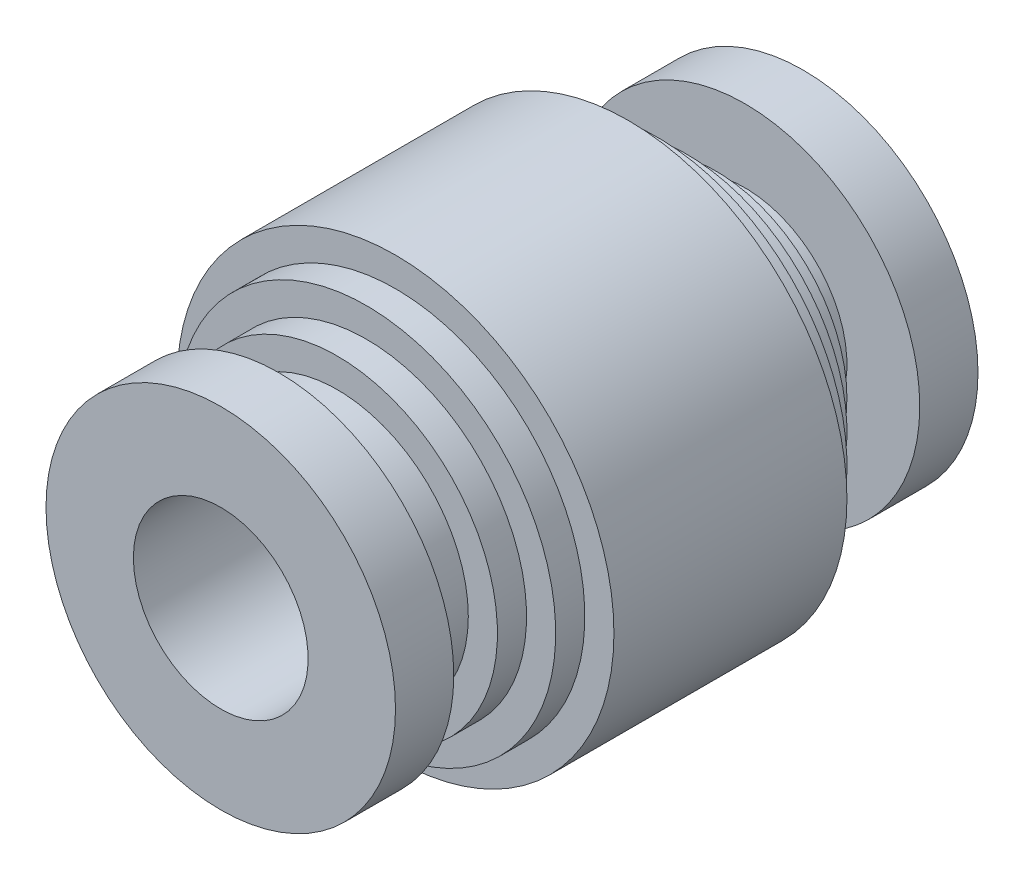
ISO-10303-21;
HEADER;
FILE_DESCRIPTION(('STEP AP214'),'2;1');
FILE_NAME('part.step','',(''),(''),'','','');
FILE_SCHEMA(('AUTOMOTIVE_DESIGN { 1 0 10303 214 1 1 1 1 }'));
ENDSEC;
DATA;
#1=APPLICATION_CONTEXT('core data for automotive mechanical design processes');
#2=APPLICATION_PROTOCOL_DEFINITION('international standard','automotive_design',2000,#1);
#3=PRODUCT_CONTEXT('',#1,'mechanical');
#4=PRODUCT('Part','Part','',(#3));
#5=PRODUCT_RELATED_PRODUCT_CATEGORY('part','',(#4));
#6=PRODUCT_DEFINITION_FORMATION('','',#4);
#7=PRODUCT_DEFINITION_CONTEXT('part definition',#1,'design');
#8=PRODUCT_DEFINITION('design','',#6,#7);
#9=PRODUCT_DEFINITION_SHAPE('','',#8);
#10=(LENGTH_UNIT() NAMED_UNIT(*) SI_UNIT(.MILLI.,.METRE.));
#11=(NAMED_UNIT(*) PLANE_ANGLE_UNIT() SI_UNIT($,.RADIAN.));
#12=(NAMED_UNIT(*) SI_UNIT($,.STERADIAN.) SOLID_ANGLE_UNIT());
#13=UNCERTAINTY_MEASURE_WITH_UNIT(LENGTH_MEASURE(1.E-05),#10,'distance_accuracy_value','');
#14=(GEOMETRIC_REPRESENTATION_CONTEXT(3) GLOBAL_UNCERTAINTY_ASSIGNED_CONTEXT((#13)) GLOBAL_UNIT_ASSIGNED_CONTEXT((#10,
#11,#12)) REPRESENTATION_CONTEXT('',''));
#15=CARTESIAN_POINT('',(0.,0.,0.));
#16=DIRECTION('',(0.,0.,1.));
#17=DIRECTION('',(1.,0.,0.));
#18=AXIS2_PLACEMENT_3D('',#15,#16,#17);
#19=CARTESIAN_POINT('',(0.,0.,6.));
#20=DIRECTION('',(0.,0.,1.));
#21=DIRECTION('',(1.,0.,0.));
#22=AXIS2_PLACEMENT_3D('',#19,#20,#21);
#23=PLANE('',#22);
#24=CARTESIAN_POINT('',(0.,0.,6.));
#25=DIRECTION('',(0.,0.,-1.));
#26=DIRECTION('',(-1.,0.,0.));
#27=AXIS2_PLACEMENT_3D('',#24,#25,#26);
#28=CIRCLE('',#27,4.5);
#29=CARTESIAN_POINT('',(-4.5,0.,6.));
#30=VERTEX_POINT('',#29);
#31=EDGE_CURVE('E112',#30,#30,#28,.T.);
#32=ORIENTED_EDGE('',*,*,#31,.T.);
#33=EDGE_LOOP('',(#32));
#34=FACE_BOUND('',#33,.T.);
#35=CARTESIAN_POINT('',(0.,0.,6.));
#36=DIRECTION('',(0.,0.,-1.));
#37=DIRECTION('',(-1.,0.,0.));
#38=AXIS2_PLACEMENT_3D('',#35,#36,#37);
#39=CIRCLE('',#38,5.5);
#40=CARTESIAN_POINT('',(-5.5,0.,6.));
#41=VERTEX_POINT('',#40);
#42=EDGE_CURVE('E10',#41,#41,#39,.T.);
#43=ORIENTED_EDGE('',*,*,#42,.F.);
#44=EDGE_LOOP('',(#43));
#45=FACE_BOUND('',#44,.T.);
#46=ADVANCED_FACE('F36',(#34,#45),#23,.T.);
#47=CARTESIAN_POINT('',(0.,0.,-9.99999999999999));
#48=DIRECTION('',(0.,0.,-1.));
#49=DIRECTION('',(-1.,0.,0.));
#50=AXIS2_PLACEMENT_3D('',#47,#48,#49);
#51=CYLINDRICAL_SURFACE('',#50,5.5);
#52=CARTESIAN_POINT('',(0.,0.,5.));
#53=DIRECTION('',(0.,0.,-1.));
#54=DIRECTION('',(-1.,0.,0.));
#55=AXIS2_PLACEMENT_3D('',#52,#53,#54);
#56=CIRCLE('',#55,5.5);
#57=CARTESIAN_POINT('',(-5.5,0.,5.));
#58=VERTEX_POINT('',#57);
#59=EDGE_CURVE('E42',#58,#58,#56,.T.);
#60=ORIENTED_EDGE('',*,*,#59,.F.);
#61=EDGE_LOOP('',(#60));
#62=FACE_BOUND('',#61,.T.);
#63=ORIENTED_EDGE('',*,*,#42,.T.);
#64=EDGE_LOOP('',(#63));
#65=FACE_BOUND('',#64,.T.);
#66=ADVANCED_FACE('F130',(#62,#65),#51,.T.);
#67=CARTESIAN_POINT('',(0.,0.,5.));
#68=DIRECTION('',(0.,0.,-1.));
#69=DIRECTION('',(-1.,0.,0.));
#70=AXIS2_PLACEMENT_3D('',#67,#68,#69);
#71=PLANE('',#70);
#72=CARTESIAN_POINT('',(0.,0.,5.));
#73=DIRECTION('',(0.,0.,-1.));
#74=DIRECTION('',(-1.,0.,0.));
#75=AXIS2_PLACEMENT_3D('',#72,#73,#74);
#76=CIRCLE('',#75,6.5);
#77=CARTESIAN_POINT('',(-6.5,0.,5.));
#78=VERTEX_POINT('',#77);
#79=EDGE_CURVE('E46',#78,#78,#76,.T.);
#80=ORIENTED_EDGE('',*,*,#79,.F.);
#81=EDGE_LOOP('',(#80));
#82=FACE_BOUND('',#81,.T.);
#83=ORIENTED_EDGE('',*,*,#59,.T.);
#84=EDGE_LOOP('',(#83));
#85=FACE_BOUND('',#84,.T.);
#86=ADVANCED_FACE('F134',(#82,#85),#71,.F.);
#87=CARTESIAN_POINT('',(0.,0.,-9.99999999999999));
#88=DIRECTION('',(0.,0.,-1.));
#89=DIRECTION('',(-1.,0.,0.));
#90=AXIS2_PLACEMENT_3D('',#87,#88,#89);
#91=CYLINDRICAL_SURFACE('',#90,6.5);
#92=CARTESIAN_POINT('',(0.,0.,4.));
#93=DIRECTION('',(0.,0.,-1.));
#94=DIRECTION('',(-1.,0.,0.));
#95=AXIS2_PLACEMENT_3D('',#92,#93,#94);
#96=CIRCLE('',#95,6.5);
#97=CARTESIAN_POINT('',(-6.5,0.,4.));
#98=VERTEX_POINT('',#97);
#99=EDGE_CURVE('E50',#98,#98,#96,.T.);
#100=ORIENTED_EDGE('',*,*,#99,.F.);
#101=EDGE_LOOP('',(#100));
#102=FACE_BOUND('',#101,.T.);
#103=ORIENTED_EDGE('',*,*,#79,.T.);
#104=EDGE_LOOP('',(#103));
#105=FACE_BOUND('',#104,.T.);
#106=ADVANCED_FACE('F139',(#102,#105),#91,.T.);
#107=CARTESIAN_POINT('',(0.,0.,4.));
#108=DIRECTION('',(0.,0.,-1.));
#109=DIRECTION('',(-1.,0.,0.));
#110=AXIS2_PLACEMENT_3D('',#107,#108,#109);
#111=PLANE('',#110);
#112=CARTESIAN_POINT('',(0.,0.,4.));
#113=DIRECTION('',(0.,0.,-1.));
#114=DIRECTION('',(-1.,0.,0.));
#115=AXIS2_PLACEMENT_3D('',#112,#113,#114);
#116=CIRCLE('',#115,7.5);
#117=CARTESIAN_POINT('',(-7.5,0.,4.));
#118=VERTEX_POINT('',#117);
#119=EDGE_CURVE('E55',#118,#118,#116,.T.);
#120=ORIENTED_EDGE('',*,*,#119,.F.);
#121=EDGE_LOOP('',(#120));
#122=FACE_BOUND('',#121,.T.);
#123=ORIENTED_EDGE('',*,*,#99,.T.);
#124=EDGE_LOOP('',(#123));
#125=FACE_BOUND('',#124,.T.);
#126=ADVANCED_FACE('F145',(#122,#125),#111,.F.);
#127=CARTESIAN_POINT('',(0.,0.,-9.99999999999999));
#128=DIRECTION('',(0.,0.,-1.));
#129=DIRECTION('',(-1.,0.,0.));
#130=AXIS2_PLACEMENT_3D('',#127,#128,#129);
#131=CYLINDRICAL_SURFACE('',#130,7.5);
#132=ORIENTED_EDGE('',*,*,#119,.T.);
#133=EDGE_LOOP('',(#132));
#134=FACE_BOUND('',#133,.T.);
#135=CARTESIAN_POINT('',(0.,0.,-4.));
#136=DIRECTION('',(0.,0.,-1.));
#137=DIRECTION('',(-1.,0.,0.));
#138=AXIS2_PLACEMENT_3D('',#135,#136,#137);
#139=CIRCLE('',#138,7.5);
#140=CARTESIAN_POINT('',(-7.5,0.,-4.));
#141=VERTEX_POINT('',#140);
#142=EDGE_CURVE('E58',#141,#141,#139,.T.);
#143=ORIENTED_EDGE('',*,*,#142,.F.);
#144=EDGE_LOOP('',(#143));
#145=FACE_BOUND('',#144,.T.);
#146=ADVANCED_FACE('F149',(#134,#145),#131,.T.);
#147=CARTESIAN_POINT('',(0.,0.,-4.));
#148=DIRECTION('',(0.,0.,-1.));
#149=DIRECTION('',(-1.,0.,0.));
#150=AXIS2_PLACEMENT_3D('',#147,#148,#149);
#151=PLANE('',#150);
#152=ORIENTED_EDGE('',*,*,#142,.T.);
#153=EDGE_LOOP('',(#152));
#154=FACE_BOUND('',#153,.T.);
#155=CARTESIAN_POINT('',(0.,0.,-4.));
#156=DIRECTION('',(0.,0.,-1.));
#157=DIRECTION('',(-1.,0.,0.));
#158=AXIS2_PLACEMENT_3D('',#155,#156,#157);
#159=CIRCLE('',#158,6.5);
#160=CARTESIAN_POINT('',(-6.5,0.,-4.));
#161=VERTEX_POINT('',#160);
#162=EDGE_CURVE('E61',#161,#161,#159,.T.);
#163=ORIENTED_EDGE('',*,*,#162,.F.);
#164=EDGE_LOOP('',(#163));
#165=FACE_BOUND('',#164,.T.);
#166=ADVANCED_FACE('F153',(#154,#165),#151,.T.);
#167=CARTESIAN_POINT('',(0.,0.,-9.99999999999999));
#168=DIRECTION('',(0.,0.,-1.));
#169=DIRECTION('',(-1.,0.,0.));
#170=AXIS2_PLACEMENT_3D('',#167,#168,#169);
#171=CYLINDRICAL_SURFACE('',#170,6.5);
#172=ORIENTED_EDGE('',*,*,#162,.T.);
#173=EDGE_LOOP('',(#172));
#174=FACE_BOUND('',#173,.T.);
#175=CARTESIAN_POINT('',(0.,0.,-5.));
#176=DIRECTION('',(0.,0.,-1.));
#177=DIRECTION('',(-1.,0.,0.));
#178=AXIS2_PLACEMENT_3D('',#175,#176,#177);
#179=CIRCLE('',#178,6.5);
#180=CARTESIAN_POINT('',(-6.5,0.,-5.));
#181=VERTEX_POINT('',#180);
#182=EDGE_CURVE('E64',#181,#181,#179,.T.);
#183=ORIENTED_EDGE('',*,*,#182,.F.);
#184=EDGE_LOOP('',(#183));
#185=FACE_BOUND('',#184,.T.);
#186=ADVANCED_FACE('F157',(#174,#185),#171,.T.);
#187=CARTESIAN_POINT('',(0.,0.,-5.));
#188=DIRECTION('',(0.,0.,-1.));
#189=DIRECTION('',(-1.,0.,0.));
#190=AXIS2_PLACEMENT_3D('',#187,#188,#189);
#191=PLANE('',#190);
#192=ORIENTED_EDGE('',*,*,#182,.T.);
#193=EDGE_LOOP('',(#192));
#194=FACE_BOUND('',#193,.T.);
#195=CARTESIAN_POINT('',(0.,0.,-5.));
#196=DIRECTION('',(0.,0.,-1.));
#197=DIRECTION('',(-1.,0.,0.));
#198=AXIS2_PLACEMENT_3D('',#195,#196,#197);
#199=CIRCLE('',#198,5.5);
#200=CARTESIAN_POINT('',(-5.5,0.,-5.));
#201=VERTEX_POINT('',#200);
#202=EDGE_CURVE('E67',#201,#201,#199,.T.);
#203=ORIENTED_EDGE('',*,*,#202,.F.);
#204=EDGE_LOOP('',(#203));
#205=FACE_BOUND('',#204,.T.);
#206=ADVANCED_FACE('F161',(#194,#205),#191,.T.);
#207=CARTESIAN_POINT('',(0.,0.,-9.99999999999999));
#208=DIRECTION('',(0.,0.,-1.));
#209=DIRECTION('',(-1.,0.,0.));
#210=AXIS2_PLACEMENT_3D('',#207,#208,#209);
#211=CYLINDRICAL_SURFACE('',#210,5.5);
#212=ORIENTED_EDGE('',*,*,#202,.T.);
#213=EDGE_LOOP('',(#212));
#214=FACE_BOUND('',#213,.T.);
#215=CARTESIAN_POINT('',(0.,0.,-6.));
#216=DIRECTION('',(0.,0.,-1.));
#217=DIRECTION('',(-1.,0.,0.));
#218=AXIS2_PLACEMENT_3D('',#215,#216,#217);
#219=CIRCLE('',#218,5.5);
#220=CARTESIAN_POINT('',(-5.5,0.,-6.));
#221=VERTEX_POINT('',#220);
#222=EDGE_CURVE('E70',#221,#221,#219,.T.);
#223=ORIENTED_EDGE('',*,*,#222,.F.);
#224=EDGE_LOOP('',(#223));
#225=FACE_BOUND('',#224,.T.);
#226=ADVANCED_FACE('F165',(#214,#225),#211,.T.);
#227=CARTESIAN_POINT('',(0.,0.,-6.));
#228=DIRECTION('',(0.,0.,1.));
#229=DIRECTION('',(1.,0.,0.));
#230=AXIS2_PLACEMENT_3D('',#227,#228,#229);
#231=PLANE('',#230);
#232=CARTESIAN_POINT('',(0.,0.,-6.));
#233=DIRECTION('',(0.,0.,-1.));
#234=DIRECTION('',(-1.,0.,0.));
#235=AXIS2_PLACEMENT_3D('',#232,#233,#234);
#236=CIRCLE('',#235,4.5);
#237=CARTESIAN_POINT('',(-4.5,0.,-6.));
#238=VERTEX_POINT('',#237);
#239=EDGE_CURVE('E73',#238,#238,#236,.T.);
#240=ORIENTED_EDGE('',*,*,#239,.F.);
#241=EDGE_LOOP('',(#240));
#242=FACE_BOUND('',#241,.T.);
#243=ORIENTED_EDGE('',*,*,#222,.T.);
#244=EDGE_LOOP('',(#243));
#245=FACE_BOUND('',#244,.T.);
#246=ADVANCED_FACE('F169',(#242,#245),#231,.F.);
#247=CARTESIAN_POINT('',(0.,0.,-9.99999999999999));
#248=DIRECTION('',(0.,0.,-1.));
#249=DIRECTION('',(-1.,0.,0.));
#250=AXIS2_PLACEMENT_3D('',#247,#248,#249);
#251=CYLINDRICAL_SURFACE('',#250,4.5);
#252=CARTESIAN_POINT('',(0.,0.,-7.));
#253=DIRECTION('',(0.,0.,-1.));
#254=DIRECTION('',(-1.,0.,0.));
#255=AXIS2_PLACEMENT_3D('',#252,#253,#254);
#256=CIRCLE('',#255,4.5);
#257=CARTESIAN_POINT('',(-4.5,0.,-7.));
#258=VERTEX_POINT('',#257);
#259=EDGE_CURVE('E76',#258,#258,#256,.T.);
#260=ORIENTED_EDGE('',*,*,#259,.F.);
#261=EDGE_LOOP('',(#260));
#262=FACE_BOUND('',#261,.T.);
#263=ORIENTED_EDGE('',*,*,#239,.T.);
#264=EDGE_LOOP('',(#263));
#265=FACE_BOUND('',#264,.T.);
#266=ADVANCED_FACE('F173',(#262,#265),#251,.T.);
#267=CARTESIAN_POINT('',(0.,0.,-7.));
#268=DIRECTION('',(0.,0.,1.));
#269=DIRECTION('',(1.,0.,0.));
#270=AXIS2_PLACEMENT_3D('',#267,#268,#269);
#271=PLANE('',#270);
#272=CARTESIAN_POINT('',(0.,0.,-7.));
#273=DIRECTION('',(0.,0.,-1.));
#274=DIRECTION('',(-1.,0.,0.));
#275=AXIS2_PLACEMENT_3D('',#272,#273,#274);
#276=CIRCLE('',#275,3.5);
#277=CARTESIAN_POINT('',(-3.5,0.,-7.));
#278=VERTEX_POINT('',#277);
#279=EDGE_CURVE('E79',#278,#278,#276,.T.);
#280=ORIENTED_EDGE('',*,*,#279,.F.);
#281=EDGE_LOOP('',(#280));
#282=FACE_BOUND('',#281,.T.);
#283=ORIENTED_EDGE('',*,*,#259,.T.);
#284=EDGE_LOOP('',(#283));
#285=FACE_BOUND('',#284,.T.);
#286=ADVANCED_FACE('F177',(#282,#285),#271,.F.);
#287=CARTESIAN_POINT('',(0.,0.,-9.99999999999999));
#288=DIRECTION('',(0.,0.,-1.));
#289=DIRECTION('',(-1.,0.,0.));
#290=AXIS2_PLACEMENT_3D('',#287,#288,#289);
#291=CYLINDRICAL_SURFACE('',#290,3.5);
#292=CARTESIAN_POINT('',(0.,0.,-8.));
#293=DIRECTION('',(0.,0.,-1.));
#294=DIRECTION('',(-1.,0.,0.));
#295=AXIS2_PLACEMENT_3D('',#292,#293,#294);
#296=CIRCLE('',#295,3.5);
#297=CARTESIAN_POINT('',(-3.5,0.,-8.));
#298=VERTEX_POINT('',#297);
#299=EDGE_CURVE('E82',#298,#298,#296,.T.);
#300=ORIENTED_EDGE('',*,*,#299,.F.);
#301=EDGE_LOOP('',(#300));
#302=FACE_BOUND('',#301,.T.);
#303=ORIENTED_EDGE('',*,*,#279,.T.);
#304=EDGE_LOOP('',(#303));
#305=FACE_BOUND('',#304,.T.);
#306=ADVANCED_FACE('F181',(#302,#305),#291,.T.);
#307=CARTESIAN_POINT('',(0.,0.,-8.));
#308=DIRECTION('',(0.,0.,-1.));
#309=DIRECTION('',(-1.,0.,0.));
#310=AXIS2_PLACEMENT_3D('',#307,#308,#309);
#311=PLANE('',#310);
#312=CARTESIAN_POINT('',(0.,0.,-8.));
#313=DIRECTION('',(0.,0.,-1.));
#314=DIRECTION('',(-1.,0.,0.));
#315=AXIS2_PLACEMENT_3D('',#312,#313,#314);
#316=CIRCLE('',#315,6.);
#317=CARTESIAN_POINT('',(-6.,0.,-8.));
#318=VERTEX_POINT('',#317);
#319=EDGE_CURVE('E85',#318,#318,#316,.T.);
#320=ORIENTED_EDGE('',*,*,#319,.F.);
#321=EDGE_LOOP('',(#320));
#322=FACE_BOUND('',#321,.T.);
#323=ORIENTED_EDGE('',*,*,#299,.T.);
#324=EDGE_LOOP('',(#323));
#325=FACE_BOUND('',#324,.T.);
#326=ADVANCED_FACE('F185',(#322,#325),#311,.F.);
#327=CARTESIAN_POINT('',(0.,0.,-9.99999999999999));
#328=DIRECTION('',(0.,0.,-1.));
#329=DIRECTION('',(-1.,0.,0.));
#330=AXIS2_PLACEMENT_3D('',#327,#328,#329);
#331=CYLINDRICAL_SURFACE('',#330,6.);
#332=CARTESIAN_POINT('',(0.,0.,-10.));
#333=DIRECTION('',(0.,0.,-1.));
#334=DIRECTION('',(-1.,0.,0.));
#335=AXIS2_PLACEMENT_3D('',#332,#333,#334);
#336=CIRCLE('',#335,6.);
#337=CARTESIAN_POINT('',(-6.,0.,-10.));
#338=VERTEX_POINT('',#337);
#339=EDGE_CURVE('E88',#338,#338,#336,.T.);
#340=ORIENTED_EDGE('',*,*,#339,.F.);
#341=EDGE_LOOP('',(#340));
#342=FACE_BOUND('',#341,.T.);
#343=ORIENTED_EDGE('',*,*,#319,.T.);
#344=EDGE_LOOP('',(#343));
#345=FACE_BOUND('',#344,.T.);
#346=ADVANCED_FACE('F189',(#342,#345),#331,.T.);
#347=CARTESIAN_POINT('',(0.,0.,-9.99999999999999));
#348=DIRECTION('',(0.,0.,1.));
#349=DIRECTION('',(1.,0.,0.));
#350=AXIS2_PLACEMENT_3D('',#347,#348,#349);
#351=PLANE('',#350);
#352=CARTESIAN_POINT('',(0.,0.,-9.99999999999999));
#353=DIRECTION('',(0.,0.,-1.));
#354=DIRECTION('',(-1.,0.,0.));
#355=AXIS2_PLACEMENT_3D('',#352,#353,#354);
#356=CIRCLE('',#355,3.);
#357=CARTESIAN_POINT('',(-3.,0.,-9.99999999999999));
#358=VERTEX_POINT('',#357);
#359=EDGE_CURVE('E91',#358,#358,#356,.T.);
#360=ORIENTED_EDGE('',*,*,#359,.F.);
#361=EDGE_LOOP('',(#360));
#362=FACE_BOUND('',#361,.T.);
#363=ORIENTED_EDGE('',*,*,#339,.T.);
#364=EDGE_LOOP('',(#363));
#365=FACE_BOUND('',#364,.T.);
#366=ADVANCED_FACE('F193',(#362,#365),#351,.F.);
#367=CARTESIAN_POINT('',(0.,0.,-9.99999999999999));
#368=DIRECTION('',(0.,0.,-1.));
#369=DIRECTION('',(-1.,0.,0.));
#370=AXIS2_PLACEMENT_3D('',#367,#368,#369);
#371=CYLINDRICAL_SURFACE('',#370,3.);
#372=CARTESIAN_POINT('',(0.,0.,10.));
#373=DIRECTION('',(0.,0.,-1.));
#374=DIRECTION('',(-1.,0.,0.));
#375=AXIS2_PLACEMENT_3D('',#372,#373,#374);
#376=CIRCLE('',#375,3.);
#377=CARTESIAN_POINT('',(-3.,0.,10.));
#378=VERTEX_POINT('',#377);
#379=EDGE_CURVE('E94',#378,#378,#376,.T.);
#380=ORIENTED_EDGE('',*,*,#379,.F.);
#381=EDGE_LOOP('',(#380));
#382=FACE_BOUND('',#381,.T.);
#383=ORIENTED_EDGE('',*,*,#359,.T.);
#384=EDGE_LOOP('',(#383));
#385=FACE_BOUND('',#384,.T.);
#386=ADVANCED_FACE('F197',(#382,#385),#371,.F.);
#387=CARTESIAN_POINT('',(0.,0.,9.99999999999999));
#388=DIRECTION('',(0.,0.,1.));
#389=DIRECTION('',(1.,0.,0.));
#390=AXIS2_PLACEMENT_3D('',#387,#388,#389);
#391=PLANE('',#390);
#392=ORIENTED_EDGE('',*,*,#379,.T.);
#393=EDGE_LOOP('',(#392));
#394=FACE_BOUND('',#393,.T.);
#395=CARTESIAN_POINT('',(0.,0.,10.));
#396=DIRECTION('',(0.,0.,-1.));
#397=DIRECTION('',(-1.,0.,0.));
#398=AXIS2_PLACEMENT_3D('',#395,#396,#397);
#399=CIRCLE('',#398,6.);
#400=CARTESIAN_POINT('',(-6.,0.,10.));
#401=VERTEX_POINT('',#400);
#402=EDGE_CURVE('E97',#401,#401,#399,.T.);
#403=ORIENTED_EDGE('',*,*,#402,.F.);
#404=EDGE_LOOP('',(#403));
#405=FACE_BOUND('',#404,.T.);
#406=ADVANCED_FACE('F201',(#394,#405),#391,.T.);
#407=CARTESIAN_POINT('',(0.,0.,-9.99999999999999));
#408=DIRECTION('',(0.,0.,-1.));
#409=DIRECTION('',(-1.,0.,0.));
#410=AXIS2_PLACEMENT_3D('',#407,#408,#409);
#411=CYLINDRICAL_SURFACE('',#410,6.);
#412=ORIENTED_EDGE('',*,*,#402,.T.);
#413=EDGE_LOOP('',(#412));
#414=FACE_BOUND('',#413,.T.);
#415=CARTESIAN_POINT('',(0.,0.,7.99999999999999));
#416=DIRECTION('',(0.,0.,-1.));
#417=DIRECTION('',(-1.,0.,0.));
#418=AXIS2_PLACEMENT_3D('',#415,#416,#417);
#419=CIRCLE('',#418,6.);
#420=CARTESIAN_POINT('',(-6.,0.,7.99999999999999));
#421=VERTEX_POINT('',#420);
#422=EDGE_CURVE('E100',#421,#421,#419,.T.);
#423=ORIENTED_EDGE('',*,*,#422,.F.);
#424=EDGE_LOOP('',(#423));
#425=FACE_BOUND('',#424,.T.);
#426=ADVANCED_FACE('F205',(#414,#425),#411,.T.);
#427=CARTESIAN_POINT('',(0.,0.,8.));
#428=DIRECTION('',(0.,0.,-1.));
#429=DIRECTION('',(-1.,0.,0.));
#430=AXIS2_PLACEMENT_3D('',#427,#428,#429);
#431=PLANE('',#430);
#432=ORIENTED_EDGE('',*,*,#422,.T.);
#433=EDGE_LOOP('',(#432));
#434=FACE_BOUND('',#433,.T.);
#435=CARTESIAN_POINT('',(0.,0.,7.99999999999999));
#436=DIRECTION('',(0.,0.,-1.));
#437=DIRECTION('',(-1.,0.,0.));
#438=AXIS2_PLACEMENT_3D('',#435,#436,#437);
#439=CIRCLE('',#438,3.5);
#440=CARTESIAN_POINT('',(-3.5,0.,7.99999999999999));
#441=VERTEX_POINT('',#440);
#442=EDGE_CURVE('E103',#441,#441,#439,.T.);
#443=ORIENTED_EDGE('',*,*,#442,.F.);
#444=EDGE_LOOP('',(#443));
#445=FACE_BOUND('',#444,.T.);
#446=ADVANCED_FACE('F209',(#434,#445),#431,.T.);
#447=CARTESIAN_POINT('',(0.,0.,-9.99999999999999));
#448=DIRECTION('',(0.,0.,-1.));
#449=DIRECTION('',(-1.,0.,0.));
#450=AXIS2_PLACEMENT_3D('',#447,#448,#449);
#451=CYLINDRICAL_SURFACE('',#450,3.5);
#452=ORIENTED_EDGE('',*,*,#442,.T.);
#453=EDGE_LOOP('',(#452));
#454=FACE_BOUND('',#453,.T.);
#455=CARTESIAN_POINT('',(0.,0.,7.));
#456=DIRECTION('',(0.,0.,-1.));
#457=DIRECTION('',(-1.,0.,0.));
#458=AXIS2_PLACEMENT_3D('',#455,#456,#457);
#459=CIRCLE('',#458,3.5);
#460=CARTESIAN_POINT('',(-3.5,0.,7.));
#461=VERTEX_POINT('',#460);
#462=EDGE_CURVE('E106',#461,#461,#459,.T.);
#463=ORIENTED_EDGE('',*,*,#462,.F.);
#464=EDGE_LOOP('',(#463));
#465=FACE_BOUND('',#464,.T.);
#466=ADVANCED_FACE('F126',(#454,#465),#451,.T.);
#467=CARTESIAN_POINT('',(0.,0.,7.));
#468=DIRECTION('',(0.,0.,1.));
#469=DIRECTION('',(1.,0.,0.));
#470=AXIS2_PLACEMENT_3D('',#467,#468,#469);
#471=PLANE('',#470);
#472=ORIENTED_EDGE('',*,*,#462,.T.);
#473=EDGE_LOOP('',(#472));
#474=FACE_BOUND('',#473,.T.);
#475=CARTESIAN_POINT('',(0.,0.,7.));
#476=DIRECTION('',(0.,0.,-1.));
#477=DIRECTION('',(-1.,0.,0.));
#478=AXIS2_PLACEMENT_3D('',#475,#476,#477);
#479=CIRCLE('',#478,4.5);
#480=CARTESIAN_POINT('',(-4.5,0.,7.));
#481=VERTEX_POINT('',#480);
#482=EDGE_CURVE('E109',#481,#481,#479,.T.);
#483=ORIENTED_EDGE('',*,*,#482,.F.);
#484=EDGE_LOOP('',(#483));
#485=FACE_BOUND('',#484,.T.);
#486=ADVANCED_FACE('F120',(#474,#485),#471,.T.);
#487=CARTESIAN_POINT('',(0.,0.,-9.99999999999999));
#488=DIRECTION('',(0.,0.,-1.));
#489=DIRECTION('',(-1.,0.,0.));
#490=AXIS2_PLACEMENT_3D('',#487,#488,#489);
#491=CYLINDRICAL_SURFACE('',#490,4.5);
#492=ORIENTED_EDGE('',*,*,#482,.T.);
#493=EDGE_LOOP('',(#492));
#494=FACE_BOUND('',#493,.T.);
#495=ORIENTED_EDGE('',*,*,#31,.F.);
#496=EDGE_LOOP('',(#495));
#497=FACE_BOUND('',#496,.T.);
#498=ADVANCED_FACE('F118',(#494,#497),#491,.T.);
#499=CLOSED_SHELL('',(#46,#66,#86,#106,#126,#146,#166,#186,#206,#226,#246,#266,#286,#306,#326,
#346,#366,#386,#406,#426,#446,#466,#486,#498));
#500=MANIFOLD_SOLID_BREP('B2',#499);
#501=ADVANCED_BREP_SHAPE_REPRESENTATION('',(#18,#500),#14);
#502=SHAPE_DEFINITION_REPRESENTATION(#9,#501);
ENDSEC;
END-ISO-10303-21;
